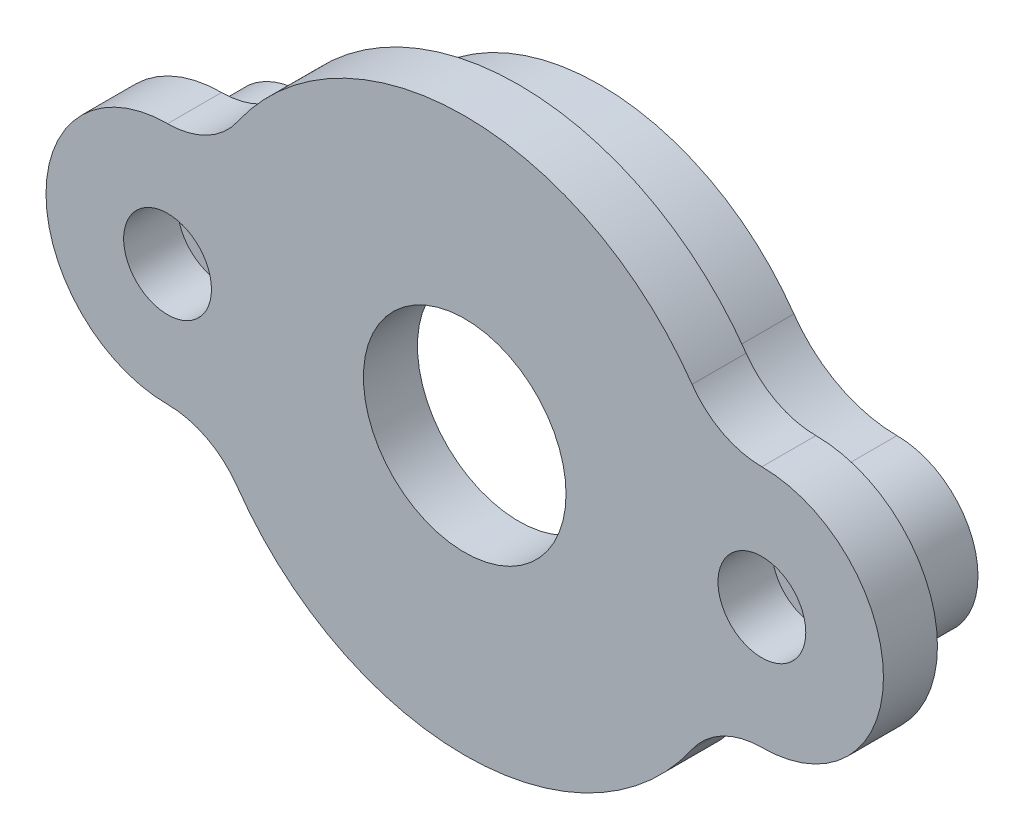
ISO-10303-21;
HEADER;
FILE_DESCRIPTION(('STEP AP214'),'2;1');
FILE_NAME('part.step','',(''),(''),'','','');
FILE_SCHEMA(('AUTOMOTIVE_DESIGN { 1 0 10303 214 1 1 1 1 }'));
ENDSEC;
DATA;
#1=APPLICATION_CONTEXT('core data for automotive mechanical design processes');
#2=APPLICATION_PROTOCOL_DEFINITION('international standard','automotive_design',2000,#1);
#3=PRODUCT_CONTEXT('',#1,'mechanical');
#4=PRODUCT('Part','Part','',(#3));
#5=PRODUCT_RELATED_PRODUCT_CATEGORY('part','',(#4));
#6=PRODUCT_DEFINITION_FORMATION('','',#4);
#7=PRODUCT_DEFINITION_CONTEXT('part definition',#1,'design');
#8=PRODUCT_DEFINITION('design','',#6,#7);
#9=PRODUCT_DEFINITION_SHAPE('','',#8);
#10=(LENGTH_UNIT() NAMED_UNIT(*) SI_UNIT(.MILLI.,.METRE.));
#11=(NAMED_UNIT(*) PLANE_ANGLE_UNIT() SI_UNIT($,.RADIAN.));
#12=(NAMED_UNIT(*) SI_UNIT($,.STERADIAN.) SOLID_ANGLE_UNIT());
#13=UNCERTAINTY_MEASURE_WITH_UNIT(LENGTH_MEASURE(1.E-05),#10,'distance_accuracy_value','');
#14=(GEOMETRIC_REPRESENTATION_CONTEXT(3) GLOBAL_UNCERTAINTY_ASSIGNED_CONTEXT((#13)) GLOBAL_UNIT_ASSIGNED_CONTEXT((#10,
#11,#12)) REPRESENTATION_CONTEXT('',''));
#15=CARTESIAN_POINT('',(0.,0.,0.));
#16=DIRECTION('',(0.,0.,1.));
#17=DIRECTION('',(1.,0.,0.));
#18=AXIS2_PLACEMENT_3D('',#15,#16,#17);
#19=CARTESIAN_POINT('',(-22.,0.,0.));
#20=DIRECTION('',(0.,0.,1.));
#21=DIRECTION('',(1.,0.,0.));
#22=AXIS2_PLACEMENT_3D('',#19,#20,#21);
#23=CYLINDRICAL_SURFACE('',#22,1.75);
#24=CARTESIAN_POINT('',(-22.,0.,0.));
#25=DIRECTION('',(0.,0.,1.));
#26=DIRECTION('',(1.,0.,0.));
#27=AXIS2_PLACEMENT_3D('',#24,#25,#26);
#28=CIRCLE('',#27,1.75);
#29=CARTESIAN_POINT('',(-20.25,0.,0.));
#30=VERTEX_POINT('',#29);
#31=EDGE_CURVE('E216',#30,#30,#28,.T.);
#32=ORIENTED_EDGE('',*,*,#31,.F.);
#33=EDGE_LOOP('',(#32));
#34=FACE_BOUND('',#33,.T.);
#35=CARTESIAN_POINT('',(-22.,0.,6.));
#36=DIRECTION('',(0.,0.,1.));
#37=DIRECTION('',(1.,0.,0.));
#38=AXIS2_PLACEMENT_3D('',#35,#36,#37);
#39=CIRCLE('',#38,1.75);
#40=CARTESIAN_POINT('',(-20.25,0.,6.));
#41=VERTEX_POINT('',#40);
#42=EDGE_CURVE('E38',#41,#41,#39,.F.);
#43=ORIENTED_EDGE('',*,*,#42,.F.);
#44=EDGE_LOOP('',(#43));
#45=FACE_BOUND('',#44,.T.);
#46=ADVANCED_FACE('F34',(#34,#45),#23,.F.);
#47=CARTESIAN_POINT('',(22.,0.,0.));
#48=DIRECTION('',(0.,0.,1.));
#49=DIRECTION('',(1.,0.,0.));
#50=AXIS2_PLACEMENT_3D('',#47,#48,#49);
#51=CYLINDRICAL_SURFACE('',#50,1.75);
#52=CARTESIAN_POINT('',(22.,0.,0.));
#53=DIRECTION('',(0.,0.,1.));
#54=DIRECTION('',(1.,0.,0.));
#55=AXIS2_PLACEMENT_3D('',#52,#53,#54);
#56=CIRCLE('',#55,1.75);
#57=CARTESIAN_POINT('',(23.75,0.,0.));
#58=VERTEX_POINT('',#57);
#59=EDGE_CURVE('E231',#58,#58,#56,.T.);
#60=ORIENTED_EDGE('',*,*,#59,.F.);
#61=EDGE_LOOP('',(#60));
#62=FACE_BOUND('',#61,.T.);
#63=CARTESIAN_POINT('',(22.,0.,6.));
#64=DIRECTION('',(0.,0.,1.));
#65=DIRECTION('',(1.,0.,0.));
#66=AXIS2_PLACEMENT_3D('',#63,#64,#65);
#67=CIRCLE('',#66,1.75);
#68=CARTESIAN_POINT('',(23.75,0.,6.));
#69=VERTEX_POINT('',#68);
#70=EDGE_CURVE('E210',#69,#69,#67,.F.);
#71=ORIENTED_EDGE('',*,*,#70,.F.);
#72=EDGE_LOOP('',(#71));
#73=FACE_BOUND('',#72,.T.);
#74=ADVANCED_FACE('F339',(#62,#73),#51,.F.);
#75=CARTESIAN_POINT('',(0.,0.,0.));
#76=DIRECTION('',(0.,0.,1.));
#77=DIRECTION('',(1.,0.,0.));
#78=AXIS2_PLACEMENT_3D('',#75,#76,#77);
#79=PLANE('',#78);
#80=ORIENTED_EDGE('',*,*,#59,.T.);
#81=EDGE_LOOP('',(#80));
#82=FACE_BOUND('',#81,.T.);
#83=ORIENTED_EDGE('',*,*,#31,.T.);
#84=EDGE_LOOP('',(#83));
#85=FACE_BOUND('',#84,.T.);
#86=CARTESIAN_POINT('',(0.,0.,0.));
#87=DIRECTION('',(0.,0.,1.));
#88=DIRECTION('',(1.,0.,0.));
#89=AXIS2_PLACEMENT_3D('',#86,#87,#88);
#90=CIRCLE('',#89,16.);
#91=CARTESIAN_POINT('',(16.,0.,0.));
#92=VERTEX_POINT('',#91);
#93=EDGE_CURVE('E179',#92,#92,#90,.T.);
#94=ORIENTED_EDGE('',*,*,#93,.T.);
#95=EDGE_LOOP('',(#94));
#96=FACE_BOUND('',#95,.T.);
#97=CARTESIAN_POINT('',(22.,-15.2934782608696,0.));
#98=DIRECTION('',(0.,0.,1.));
#99=DIRECTION('',(1.,0.,0.));
#100=AXIS2_PLACEMENT_3D('',#97,#98,#99);
#101=CIRCLE('',#100,9.29347826086955);
#102=CARTESIAN_POINT('',(22.,-6.,0.));
#103=VERTEX_POINT('',#102);
#104=CARTESIAN_POINT('',(14.369168356998,-9.98884381338742,0.));
#105=VERTEX_POINT('',#104);
#106=EDGE_CURVE('E162',#103,#105,#101,.T.);
#107=ORIENTED_EDGE('',*,*,#106,.T.);
#108=CARTESIAN_POINT('',(0.,0.,0.));
#109=DIRECTION('',(0.,0.,1.));
#110=DIRECTION('',(1.,0.,0.));
#111=AXIS2_PLACEMENT_3D('',#108,#109,#110);
#112=CIRCLE('',#111,17.5);
#113=CARTESIAN_POINT('',(-14.369168356998,-9.98884381338742,0.));
#114=VERTEX_POINT('',#113);
#115=EDGE_CURVE('E59',#114,#105,#112,.T.);
#116=ORIENTED_EDGE('',*,*,#115,.F.);
#117=CARTESIAN_POINT('',(-22.,-15.2934782608696,0.));
#118=DIRECTION('',(0.,0.,1.));
#119=DIRECTION('',(1.,0.,0.));
#120=AXIS2_PLACEMENT_3D('',#117,#118,#119);
#121=CIRCLE('',#120,9.29347826086955);
#122=CARTESIAN_POINT('',(-22.,-6.,0.));
#123=VERTEX_POINT('',#122);
#124=EDGE_CURVE('E274',#123,#114,#121,.F.);
#125=ORIENTED_EDGE('',*,*,#124,.F.);
#126=CARTESIAN_POINT('',(-22.,0.,0.));
#127=DIRECTION('',(0.,0.,1.));
#128=DIRECTION('',(1.,0.,0.));
#129=AXIS2_PLACEMENT_3D('',#126,#127,#128);
#130=CIRCLE('',#129,6.);
#131=CARTESIAN_POINT('',(-22.,6.,0.));
#132=VERTEX_POINT('',#131);
#133=EDGE_CURVE('E277',#132,#123,#130,.T.);
#134=ORIENTED_EDGE('',*,*,#133,.F.);
#135=CARTESIAN_POINT('',(-22.,15.2934782608696,0.));
#136=DIRECTION('',(0.,0.,1.));
#137=DIRECTION('',(1.,0.,0.));
#138=AXIS2_PLACEMENT_3D('',#135,#136,#137);
#139=CIRCLE('',#138,9.29347826086955);
#140=CARTESIAN_POINT('',(-14.369168356998,9.98884381338742,0.));
#141=VERTEX_POINT('',#140);
#142=EDGE_CURVE('E280',#132,#141,#139,.T.);
#143=ORIENTED_EDGE('',*,*,#142,.T.);
#144=CARTESIAN_POINT('',(0.,0.,0.));
#145=DIRECTION('',(0.,0.,1.));
#146=DIRECTION('',(1.,0.,0.));
#147=AXIS2_PLACEMENT_3D('',#144,#145,#146);
#148=CIRCLE('',#147,17.5);
#149=CARTESIAN_POINT('',(14.369168356998,9.98884381338742,0.));
#150=VERTEX_POINT('',#149);
#151=EDGE_CURVE('E283',#141,#150,#148,.F.);
#152=ORIENTED_EDGE('',*,*,#151,.T.);
#153=CARTESIAN_POINT('',(22.,15.2934782608696,0.));
#154=DIRECTION('',(0.,0.,1.));
#155=DIRECTION('',(1.,0.,0.));
#156=AXIS2_PLACEMENT_3D('',#153,#154,#155);
#157=CIRCLE('',#156,9.29347826086955);
#158=CARTESIAN_POINT('',(22.,6.,0.));
#159=VERTEX_POINT('',#158);
#160=EDGE_CURVE('E286',#159,#150,#157,.F.);
#161=ORIENTED_EDGE('',*,*,#160,.F.);
#162=CARTESIAN_POINT('',(22.,0.,0.));
#163=DIRECTION('',(0.,0.,1.));
#164=DIRECTION('',(1.,0.,0.));
#165=AXIS2_PLACEMENT_3D('',#162,#163,#164);
#166=CIRCLE('',#165,6.);
#167=EDGE_CURVE('E289',#103,#159,#166,.T.);
#168=ORIENTED_EDGE('',*,*,#167,.F.);
#169=EDGE_LOOP('',(#107,#116,#125,#134,#143,#152,#161,#168));
#170=FACE_BOUND('',#169,.T.);
#171=ADVANCED_FACE('F320',(#82,#85,#96,#170),#79,.F.);
#172=CARTESIAN_POINT('',(-22.,15.2934782608696,10.));
#173=DIRECTION('',(0.,0.,-1.));
#174=DIRECTION('',(-1.,0.,0.));
#175=AXIS2_PLACEMENT_3D('',#172,#173,#174);
#176=CYLINDRICAL_SURFACE('',#175,6.29347826086955);
#177=CARTESIAN_POINT('',(-22.,15.2934782608696,6.));
#178=DIRECTION('',(0.,0.,1.));
#179=DIRECTION('',(1.,0.,0.));
#180=AXIS2_PLACEMENT_3D('',#177,#178,#179);
#181=CIRCLE('',#180,6.29347826086955);
#182=CARTESIAN_POINT('',(-22.,9.,6.));
#183=VERTEX_POINT('',#182);
#184=CARTESIAN_POINT('',(-16.8324543610548,11.7012170385396,6.));
#185=VERTEX_POINT('',#184);
#186=EDGE_CURVE('E51',#183,#185,#181,.T.);
#187=ORIENTED_EDGE('',*,*,#186,.F.);
#188=DIRECTION('',(0.,0.,-1.));
#189=VECTOR('',#188,1.);
#190=CARTESIAN_POINT('',(-22.,9.,10.));
#191=LINE('',#190,#189);
#192=CARTESIAN_POINT('',(-22.,9.,10.));
#193=VERTEX_POINT('',#192);
#194=EDGE_CURVE('E11',#193,#183,#191,.T.);
#195=ORIENTED_EDGE('',*,*,#194,.F.);
#196=CARTESIAN_POINT('',(-22.,15.2934782608696,10.));
#197=DIRECTION('',(0.,0.,1.));
#198=DIRECTION('',(1.,0.,0.));
#199=AXIS2_PLACEMENT_3D('',#196,#197,#198);
#200=CIRCLE('',#199,6.29347826086955);
#201=CARTESIAN_POINT('',(-16.8324543610548,11.7012170385396,10.));
#202=VERTEX_POINT('',#201);
#203=EDGE_CURVE('E170',#193,#202,#200,.T.);
#204=ORIENTED_EDGE('',*,*,#203,.T.);
#205=DIRECTION('',(0.,0.,-1.));
#206=VECTOR('',#205,1.);
#207=CARTESIAN_POINT('',(-16.8324543610548,11.7012170385396,10.));
#208=LINE('',#207,#206);
#209=EDGE_CURVE('E161',#202,#185,#208,.T.);
#210=ORIENTED_EDGE('',*,*,#209,.T.);
#211=EDGE_LOOP('',(#187,#195,#204,#210));
#212=FACE_BOUND('',#211,.T.);
#213=ADVANCED_FACE('F36',(#212),#176,.F.);
#214=CARTESIAN_POINT('',(-22.,0.,10.));
#215=DIRECTION('',(0.,0.,-1.));
#216=DIRECTION('',(-1.,0.,0.));
#217=AXIS2_PLACEMENT_3D('',#214,#215,#216);
#218=CYLINDRICAL_SURFACE('',#217,9.);
#219=ORIENTED_EDGE('',*,*,#194,.T.);
#220=CARTESIAN_POINT('',(-22.,0.,6.));
#221=DIRECTION('',(0.,0.,1.));
#222=DIRECTION('',(1.,0.,0.));
#223=AXIS2_PLACEMENT_3D('',#220,#221,#222);
#224=CIRCLE('',#223,9.);
#225=CARTESIAN_POINT('',(-22.,-9.,6.));
#226=VERTEX_POINT('',#225);
#227=EDGE_CURVE('E148',#183,#226,#224,.T.);
#228=ORIENTED_EDGE('',*,*,#227,.T.);
#229=DIRECTION('',(0.,0.,-1.));
#230=VECTOR('',#229,1.);
#231=CARTESIAN_POINT('',(-22.,-9.,10.));
#232=LINE('',#231,#230);
#233=CARTESIAN_POINT('',(-22.,-9.,10.));
#234=VERTEX_POINT('',#233);
#235=EDGE_CURVE('E43',#234,#226,#232,.T.);
#236=ORIENTED_EDGE('',*,*,#235,.F.);
#237=CARTESIAN_POINT('',(-22.,0.,10.));
#238=DIRECTION('',(0.,0.,1.));
#239=DIRECTION('',(1.,0.,0.));
#240=AXIS2_PLACEMENT_3D('',#237,#238,#239);
#241=CIRCLE('',#240,9.);
#242=EDGE_CURVE('E165',#193,#234,#241,.T.);
#243=ORIENTED_EDGE('',*,*,#242,.F.);
#244=EDGE_LOOP('',(#219,#228,#236,#243));
#245=FACE_BOUND('',#244,.T.);
#246=ADVANCED_FACE('F164',(#245),#218,.T.);
#247=CARTESIAN_POINT('',(-22.,-15.2934782608696,10.));
#248=DIRECTION('',(0.,0.,-1.));
#249=DIRECTION('',(-1.,0.,0.));
#250=AXIS2_PLACEMENT_3D('',#247,#248,#249);
#251=CYLINDRICAL_SURFACE('',#250,6.29347826086955);
#252=ORIENTED_EDGE('',*,*,#235,.T.);
#253=CARTESIAN_POINT('',(-22.,-15.2934782608696,6.));
#254=DIRECTION('',(0.,0.,1.));
#255=DIRECTION('',(1.,0.,0.));
#256=AXIS2_PLACEMENT_3D('',#253,#254,#255);
#257=CIRCLE('',#256,6.29347826086955);
#258=CARTESIAN_POINT('',(-16.8324543610548,-11.7012170385395,6.));
#259=VERTEX_POINT('',#258);
#260=EDGE_CURVE('E152',#226,#259,#257,.F.);
#261=ORIENTED_EDGE('',*,*,#260,.T.);
#262=DIRECTION('',(0.,0.,-1.));
#263=VECTOR('',#262,1.);
#264=CARTESIAN_POINT('',(-16.8324543610548,-11.7012170385395,10.));
#265=LINE('',#264,#263);
#266=CARTESIAN_POINT('',(-16.8324543610548,-11.7012170385395,10.));
#267=VERTEX_POINT('',#266);
#268=EDGE_CURVE('E207',#267,#259,#265,.T.);
#269=ORIENTED_EDGE('',*,*,#268,.F.);
#270=CARTESIAN_POINT('',(-22.,-15.2934782608696,10.));
#271=DIRECTION('',(0.,0.,1.));
#272=DIRECTION('',(1.,0.,0.));
#273=AXIS2_PLACEMENT_3D('',#270,#271,#272);
#274=CIRCLE('',#273,6.29347826086955);
#275=EDGE_CURVE('E169',#234,#267,#274,.F.);
#276=ORIENTED_EDGE('',*,*,#275,.F.);
#277=EDGE_LOOP('',(#252,#261,#269,#276));
#278=FACE_BOUND('',#277,.T.);
#279=ADVANCED_FACE('F561',(#278),#251,.F.);
#280=CARTESIAN_POINT('',(0.,0.,10.));
#281=DIRECTION('',(0.,0.,-1.));
#282=DIRECTION('',(-1.,0.,0.));
#283=AXIS2_PLACEMENT_3D('',#280,#281,#282);
#284=CYLINDRICAL_SURFACE('',#283,20.5);
#285=ORIENTED_EDGE('',*,*,#268,.T.);
#286=CARTESIAN_POINT('',(0.,0.,6.));
#287=DIRECTION('',(0.,0.,1.));
#288=DIRECTION('',(1.,0.,0.));
#289=AXIS2_PLACEMENT_3D('',#286,#287,#288);
#290=CIRCLE('',#289,20.5);
#291=CARTESIAN_POINT('',(16.8324543610548,-11.7012170385396,6.));
#292=VERTEX_POINT('',#291);
#293=EDGE_CURVE('E237',#259,#292,#290,.T.);
#294=ORIENTED_EDGE('',*,*,#293,.T.);
#295=DIRECTION('',(0.,0.,-1.));
#296=VECTOR('',#295,1.);
#297=CARTESIAN_POINT('',(16.8324543610548,-11.7012170385396,10.));
#298=LINE('',#297,#296);
#299=CARTESIAN_POINT('',(16.8324543610548,-11.7012170385396,10.));
#300=VERTEX_POINT('',#299);
#301=EDGE_CURVE('E204',#300,#292,#298,.T.);
#302=ORIENTED_EDGE('',*,*,#301,.F.);
#303=CARTESIAN_POINT('',(0.,0.,10.));
#304=DIRECTION('',(0.,0.,1.));
#305=DIRECTION('',(1.,0.,0.));
#306=AXIS2_PLACEMENT_3D('',#303,#304,#305);
#307=CIRCLE('',#306,20.5);
#308=EDGE_CURVE('E184',#267,#300,#307,.T.);
#309=ORIENTED_EDGE('',*,*,#308,.F.);
#310=EDGE_LOOP('',(#285,#294,#302,#309));
#311=FACE_BOUND('',#310,.T.);
#312=ADVANCED_FACE('F552',(#311),#284,.T.);
#313=CARTESIAN_POINT('',(22.,-15.2934782608696,10.));
#314=DIRECTION('',(0.,0.,-1.));
#315=DIRECTION('',(-1.,0.,0.));
#316=AXIS2_PLACEMENT_3D('',#313,#314,#315);
#317=CYLINDRICAL_SURFACE('',#316,6.29347826086955);
#318=CARTESIAN_POINT('',(22.,-15.2934782608696,6.));
#319=DIRECTION('',(0.,0.,1.));
#320=DIRECTION('',(1.,0.,0.));
#321=AXIS2_PLACEMENT_3D('',#318,#319,#320);
#322=CIRCLE('',#321,6.29347826086955);
#323=CARTESIAN_POINT('',(22.,-9.00000000000001,6.));
#324=VERTEX_POINT('',#323);
#325=EDGE_CURVE('E240',#324,#292,#322,.T.);
#326=ORIENTED_EDGE('',*,*,#325,.F.);
#327=DIRECTION('',(0.,0.,-1.));
#328=VECTOR('',#327,1.);
#329=CARTESIAN_POINT('',(22.,-9.00000000000001,10.));
#330=LINE('',#329,#328);
#331=CARTESIAN_POINT('',(22.,-9.00000000000001,10.));
#332=VERTEX_POINT('',#331);
#333=EDGE_CURVE('E201',#332,#324,#330,.T.);
#334=ORIENTED_EDGE('',*,*,#333,.F.);
#335=CARTESIAN_POINT('',(22.,-15.2934782608696,10.));
#336=DIRECTION('',(0.,0.,1.));
#337=DIRECTION('',(1.,0.,0.));
#338=AXIS2_PLACEMENT_3D('',#335,#336,#337);
#339=CIRCLE('',#338,6.29347826086955);
#340=EDGE_CURVE('E186',#332,#300,#339,.T.);
#341=ORIENTED_EDGE('',*,*,#340,.T.);
#342=ORIENTED_EDGE('',*,*,#301,.T.);
#343=EDGE_LOOP('',(#326,#334,#341,#342));
#344=FACE_BOUND('',#343,.T.);
#345=ADVANCED_FACE('F543',(#344),#317,.F.);
#346=CARTESIAN_POINT('',(22.,0.,10.));
#347=DIRECTION('',(0.,0.,-1.));
#348=DIRECTION('',(-1.,0.,0.));
#349=AXIS2_PLACEMENT_3D('',#346,#347,#348);
#350=CYLINDRICAL_SURFACE('',#349,9.00000000000001);
#351=ORIENTED_EDGE('',*,*,#333,.T.);
#352=CARTESIAN_POINT('',(22.,0.,6.));
#353=DIRECTION('',(0.,0.,1.));
#354=DIRECTION('',(1.,0.,0.));
#355=AXIS2_PLACEMENT_3D('',#352,#353,#354);
#356=CIRCLE('',#355,9.00000000000001);
#357=CARTESIAN_POINT('',(22.,9.00000000000001,6.));
#358=VERTEX_POINT('',#357);
#359=EDGE_CURVE('E242',#324,#358,#356,.T.);
#360=ORIENTED_EDGE('',*,*,#359,.T.);
#361=DIRECTION('',(0.,0.,-1.));
#362=VECTOR('',#361,1.);
#363=CARTESIAN_POINT('',(22.,9.00000000000001,10.));
#364=LINE('',#363,#362);
#365=CARTESIAN_POINT('',(22.,9.00000000000001,10.));
#366=VERTEX_POINT('',#365);
#367=EDGE_CURVE('E198',#366,#358,#364,.T.);
#368=ORIENTED_EDGE('',*,*,#367,.F.);
#369=CARTESIAN_POINT('',(22.,0.,10.));
#370=DIRECTION('',(0.,0.,1.));
#371=DIRECTION('',(1.,0.,0.));
#372=AXIS2_PLACEMENT_3D('',#369,#370,#371);
#373=CIRCLE('',#372,9.00000000000001);
#374=EDGE_CURVE('E189',#332,#366,#373,.T.);
#375=ORIENTED_EDGE('',*,*,#374,.F.);
#376=EDGE_LOOP('',(#351,#360,#368,#375));
#377=FACE_BOUND('',#376,.T.);
#378=ADVANCED_FACE('F534',(#377),#350,.T.);
#379=CARTESIAN_POINT('',(22.,15.2934782608696,10.));
#380=DIRECTION('',(0.,0.,-1.));
#381=DIRECTION('',(-1.,0.,0.));
#382=AXIS2_PLACEMENT_3D('',#379,#380,#381);
#383=CYLINDRICAL_SURFACE('',#382,6.29347826086955);
#384=ORIENTED_EDGE('',*,*,#367,.T.);
#385=CARTESIAN_POINT('',(22.,15.2934782608696,6.));
#386=DIRECTION('',(0.,0.,1.));
#387=DIRECTION('',(1.,0.,0.));
#388=AXIS2_PLACEMENT_3D('',#385,#386,#387);
#389=CIRCLE('',#388,6.29347826086955);
#390=CARTESIAN_POINT('',(16.8324543610548,11.7012170385396,6.));
#391=VERTEX_POINT('',#390);
#392=EDGE_CURVE('E245',#358,#391,#389,.F.);
#393=ORIENTED_EDGE('',*,*,#392,.T.);
#394=DIRECTION('',(0.,0.,-1.));
#395=VECTOR('',#394,1.);
#396=CARTESIAN_POINT('',(16.8324543610548,11.7012170385396,10.));
#397=LINE('',#396,#395);
#398=CARTESIAN_POINT('',(16.8324543610548,11.7012170385396,10.));
#399=VERTEX_POINT('',#398);
#400=EDGE_CURVE('E195',#399,#391,#397,.T.);
#401=ORIENTED_EDGE('',*,*,#400,.F.);
#402=CARTESIAN_POINT('',(22.,15.2934782608696,10.));
#403=DIRECTION('',(0.,0.,1.));
#404=DIRECTION('',(1.,0.,0.));
#405=AXIS2_PLACEMENT_3D('',#402,#403,#404);
#406=CIRCLE('',#405,6.29347826086955);
#407=EDGE_CURVE('E191',#366,#399,#406,.F.);
#408=ORIENTED_EDGE('',*,*,#407,.F.);
#409=EDGE_LOOP('',(#384,#393,#401,#408));
#410=FACE_BOUND('',#409,.T.);
#411=ADVANCED_FACE('F525',(#410),#383,.F.);
#412=CARTESIAN_POINT('',(0.,0.,10.));
#413=DIRECTION('',(0.,0.,-1.));
#414=DIRECTION('',(-1.,0.,0.));
#415=AXIS2_PLACEMENT_3D('',#412,#413,#414);
#416=CYLINDRICAL_SURFACE('',#415,20.5);
#417=CARTESIAN_POINT('',(0.,0.,6.));
#418=DIRECTION('',(0.,0.,1.));
#419=DIRECTION('',(1.,0.,0.));
#420=AXIS2_PLACEMENT_3D('',#417,#418,#419);
#421=CIRCLE('',#420,20.5);
#422=EDGE_CURVE('E248',#185,#391,#421,.F.);
#423=ORIENTED_EDGE('',*,*,#422,.F.);
#424=ORIENTED_EDGE('',*,*,#209,.F.);
#425=CARTESIAN_POINT('',(0.,0.,10.));
#426=DIRECTION('',(0.,0.,1.));
#427=DIRECTION('',(1.,0.,0.));
#428=AXIS2_PLACEMENT_3D('',#425,#426,#427);
#429=CIRCLE('',#428,20.5);
#430=EDGE_CURVE('E175',#202,#399,#429,.F.);
#431=ORIENTED_EDGE('',*,*,#430,.T.);
#432=ORIENTED_EDGE('',*,*,#400,.T.);
#433=EDGE_LOOP('',(#423,#424,#431,#432));
#434=FACE_BOUND('',#433,.T.);
#435=ADVANCED_FACE('F335',(#434),#416,.T.);
#436=CARTESIAN_POINT('',(0.,0.,10.));
#437=DIRECTION('',(0.,0.,1.));
#438=DIRECTION('',(1.,0.,0.));
#439=AXIS2_PLACEMENT_3D('',#436,#437,#438);
#440=PLANE('',#439);
#441=CARTESIAN_POINT('',(22.,0.,10.));
#442=DIRECTION('',(0.,0.,1.));
#443=DIRECTION('',(1.,0.,0.));
#444=AXIS2_PLACEMENT_3D('',#441,#442,#443);
#445=CIRCLE('',#444,3.25);
#446=CARTESIAN_POINT('',(25.25,0.,10.));
#447=VERTEX_POINT('',#446);
#448=EDGE_CURVE('E218',#447,#447,#445,.T.);
#449=ORIENTED_EDGE('',*,*,#448,.F.);
#450=EDGE_LOOP('',(#449));
#451=FACE_BOUND('',#450,.T.);
#452=CARTESIAN_POINT('',(-22.,0.,10.));
#453=DIRECTION('',(0.,0.,1.));
#454=DIRECTION('',(1.,0.,0.));
#455=AXIS2_PLACEMENT_3D('',#452,#453,#454);
#456=CIRCLE('',#455,3.25);
#457=CARTESIAN_POINT('',(-18.75,0.,10.));
#458=VERTEX_POINT('',#457);
#459=EDGE_CURVE('E228',#458,#458,#456,.T.);
#460=ORIENTED_EDGE('',*,*,#459,.F.);
#461=EDGE_LOOP('',(#460));
#462=FACE_BOUND('',#461,.T.);
#463=CARTESIAN_POINT('',(0.,0.,10.));
#464=DIRECTION('',(0.,0.,1.));
#465=DIRECTION('',(1.,0.,0.));
#466=AXIS2_PLACEMENT_3D('',#463,#464,#465);
#467=CIRCLE('',#466,7.5);
#468=CARTESIAN_POINT('',(7.5,0.,10.));
#469=VERTEX_POINT('',#468);
#470=EDGE_CURVE('E310',#469,#469,#467,.T.);
#471=ORIENTED_EDGE('',*,*,#470,.F.);
#472=EDGE_LOOP('',(#471));
#473=FACE_BOUND('',#472,.T.);
#474=ORIENTED_EDGE('',*,*,#203,.F.);
#475=ORIENTED_EDGE('',*,*,#242,.T.);
#476=ORIENTED_EDGE('',*,*,#275,.T.);
#477=ORIENTED_EDGE('',*,*,#308,.T.);
#478=ORIENTED_EDGE('',*,*,#340,.F.);
#479=ORIENTED_EDGE('',*,*,#374,.T.);
#480=ORIENTED_EDGE('',*,*,#407,.T.);
#481=ORIENTED_EDGE('',*,*,#430,.F.);
#482=EDGE_LOOP('',(#474,#475,#476,#477,#478,#479,#480,#481));
#483=FACE_BOUND('',#482,.T.);
#484=ADVANCED_FACE('F173',(#451,#462,#473,#483),#440,.T.);
#485=CARTESIAN_POINT('',(0.,0.,6.));
#486=DIRECTION('',(0.,0.,-1.));
#487=DIRECTION('',(-1.,0.,0.));
#488=AXIS2_PLACEMENT_3D('',#485,#486,#487);
#489=CYLINDRICAL_SURFACE('',#488,16.);
#490=CARTESIAN_POINT('',(0.,0.,6.));
#491=DIRECTION('',(0.,0.,1.));
#492=DIRECTION('',(1.,0.,0.));
#493=AXIS2_PLACEMENT_3D('',#490,#491,#492);
#494=CIRCLE('',#493,16.);
#495=CARTESIAN_POINT('',(16.,0.,6.));
#496=VERTEX_POINT('',#495);
#497=EDGE_CURVE('E176',#496,#496,#494,.T.);
#498=ORIENTED_EDGE('',*,*,#497,.T.);
#499=EDGE_LOOP('',(#498));
#500=FACE_BOUND('',#499,.T.);
#501=ORIENTED_EDGE('',*,*,#93,.F.);
#502=EDGE_LOOP('',(#501));
#503=FACE_BOUND('',#502,.T.);
#504=ADVANCED_FACE('F323',(#500,#503),#489,.F.);
#505=CARTESIAN_POINT('',(0.,0.,6.));
#506=DIRECTION('',(0.,0.,1.));
#507=DIRECTION('',(1.,0.,0.));
#508=AXIS2_PLACEMENT_3D('',#505,#506,#507);
#509=PLANE('',#508);
#510=CARTESIAN_POINT('',(0.,0.,6.));
#511=DIRECTION('',(0.,0.,1.));
#512=DIRECTION('',(1.,0.,0.));
#513=AXIS2_PLACEMENT_3D('',#510,#511,#512);
#514=CIRCLE('',#513,7.5);
#515=CARTESIAN_POINT('',(7.5,0.,6.));
#516=VERTEX_POINT('',#515);
#517=EDGE_CURVE('E313',#516,#516,#514,.F.);
#518=ORIENTED_EDGE('',*,*,#517,.F.);
#519=EDGE_LOOP('',(#518));
#520=FACE_BOUND('',#519,.T.);
#521=ORIENTED_EDGE('',*,*,#497,.F.);
#522=EDGE_LOOP('',(#521));
#523=FACE_BOUND('',#522,.T.);
#524=ADVANCED_FACE('F325',(#520,#523),#509,.F.);
#525=CARTESIAN_POINT('',(0.,0.,10.));
#526=DIRECTION('',(0.,0.,-1.));
#527=DIRECTION('',(-1.,0.,0.));
#528=AXIS2_PLACEMENT_3D('',#525,#526,#527);
#529=CYLINDRICAL_SURFACE('',#528,7.5);
#530=ORIENTED_EDGE('',*,*,#470,.T.);
#531=EDGE_LOOP('',(#530));
#532=FACE_BOUND('',#531,.T.);
#533=ORIENTED_EDGE('',*,*,#517,.T.);
#534=EDGE_LOOP('',(#533));
#535=FACE_BOUND('',#534,.T.);
#536=ADVANCED_FACE('F332',(#532,#535),#529,.F.);
#537=CARTESIAN_POINT('',(0.,0.,6.));
#538=DIRECTION('',(0.,0.,-1.));
#539=DIRECTION('',(-1.,0.,0.));
#540=AXIS2_PLACEMENT_3D('',#537,#538,#539);
#541=CYLINDRICAL_SURFACE('',#540,17.5);
#542=ORIENTED_EDGE('',*,*,#115,.T.);
#543=DIRECTION('',(0.,0.,-1.));
#544=VECTOR('',#543,1.);
#545=CARTESIAN_POINT('',(14.369168356998,-9.98884381338742,6.));
#546=LINE('',#545,#544);
#547=CARTESIAN_POINT('',(14.369168356998,-9.98884381338742,6.));
#548=VERTEX_POINT('',#547);
#549=EDGE_CURVE('E272',#548,#105,#546,.T.);
#550=ORIENTED_EDGE('',*,*,#549,.F.);
#551=CARTESIAN_POINT('',(0.,0.,6.));
#552=DIRECTION('',(0.,0.,1.));
#553=DIRECTION('',(1.,0.,0.));
#554=AXIS2_PLACEMENT_3D('',#551,#552,#553);
#555=CIRCLE('',#554,17.5);
#556=CARTESIAN_POINT('',(-14.369168356998,-9.98884381338742,6.));
#557=VERTEX_POINT('',#556);
#558=EDGE_CURVE('E250',#557,#548,#555,.T.);
#559=ORIENTED_EDGE('',*,*,#558,.F.);
#560=DIRECTION('',(0.,0.,-1.));
#561=VECTOR('',#560,1.);
#562=CARTESIAN_POINT('',(-14.369168356998,-9.98884381338742,6.));
#563=LINE('',#562,#561);
#564=EDGE_CURVE('E308',#557,#114,#563,.T.);
#565=ORIENTED_EDGE('',*,*,#564,.T.);
#566=EDGE_LOOP('',(#542,#550,#559,#565));
#567=FACE_BOUND('',#566,.T.);
#568=ADVANCED_FACE('F381',(#567),#541,.T.);
#569=CARTESIAN_POINT('',(-22.,-15.2934782608696,6.));
#570=DIRECTION('',(0.,0.,-1.));
#571=DIRECTION('',(-1.,0.,0.));
#572=AXIS2_PLACEMENT_3D('',#569,#570,#571);
#573=CYLINDRICAL_SURFACE('',#572,9.29347826086955);
#574=ORIENTED_EDGE('',*,*,#124,.T.);
#575=ORIENTED_EDGE('',*,*,#564,.F.);
#576=CARTESIAN_POINT('',(-22.,-15.2934782608696,6.));
#577=DIRECTION('',(0.,0.,1.));
#578=DIRECTION('',(1.,0.,0.));
#579=AXIS2_PLACEMENT_3D('',#576,#577,#578);
#580=CIRCLE('',#579,9.29347826086955);
#581=CARTESIAN_POINT('',(-22.,-6.,6.));
#582=VERTEX_POINT('',#581);
#583=EDGE_CURVE('E253',#582,#557,#580,.F.);
#584=ORIENTED_EDGE('',*,*,#583,.F.);
#585=DIRECTION('',(0.,0.,-1.));
#586=VECTOR('',#585,1.);
#587=CARTESIAN_POINT('',(-22.,-6.,6.));
#588=LINE('',#587,#586);
#589=EDGE_CURVE('E306',#582,#123,#588,.T.);
#590=ORIENTED_EDGE('',*,*,#589,.T.);
#591=EDGE_LOOP('',(#574,#575,#584,#590));
#592=FACE_BOUND('',#591,.T.);
#593=ADVANCED_FACE('F377',(#592),#573,.F.);
#594=CARTESIAN_POINT('',(-22.,0.,6.));
#595=DIRECTION('',(0.,0.,-1.));
#596=DIRECTION('',(-1.,0.,0.));
#597=AXIS2_PLACEMENT_3D('',#594,#595,#596);
#598=CYLINDRICAL_SURFACE('',#597,6.);
#599=ORIENTED_EDGE('',*,*,#133,.T.);
#600=ORIENTED_EDGE('',*,*,#589,.F.);
#601=CARTESIAN_POINT('',(-22.,0.,6.));
#602=DIRECTION('',(0.,0.,1.));
#603=DIRECTION('',(1.,0.,0.));
#604=AXIS2_PLACEMENT_3D('',#601,#602,#603);
#605=CIRCLE('',#604,6.);
#606=CARTESIAN_POINT('',(-22.,6.,6.));
#607=VERTEX_POINT('',#606);
#608=EDGE_CURVE('E256',#607,#582,#605,.T.);
#609=ORIENTED_EDGE('',*,*,#608,.F.);
#610=DIRECTION('',(0.,0.,-1.));
#611=VECTOR('',#610,1.);
#612=CARTESIAN_POINT('',(-22.,6.,6.));
#613=LINE('',#612,#611);
#614=EDGE_CURVE('E304',#607,#132,#613,.T.);
#615=ORIENTED_EDGE('',*,*,#614,.T.);
#616=EDGE_LOOP('',(#599,#600,#609,#615));
#617=FACE_BOUND('',#616,.T.);
#618=ADVANCED_FACE('F373',(#617),#598,.T.);
#619=CARTESIAN_POINT('',(-22.,15.2934782608696,6.));
#620=DIRECTION('',(0.,0.,-1.));
#621=DIRECTION('',(-1.,0.,0.));
#622=AXIS2_PLACEMENT_3D('',#619,#620,#621);
#623=CYLINDRICAL_SURFACE('',#622,9.29347826086955);
#624=ORIENTED_EDGE('',*,*,#142,.F.);
#625=ORIENTED_EDGE('',*,*,#614,.F.);
#626=CARTESIAN_POINT('',(-22.,15.2934782608696,6.));
#627=DIRECTION('',(0.,0.,1.));
#628=DIRECTION('',(1.,0.,0.));
#629=AXIS2_PLACEMENT_3D('',#626,#627,#628);
#630=CIRCLE('',#629,9.29347826086955);
#631=CARTESIAN_POINT('',(-14.369168356998,9.98884381338742,6.));
#632=VERTEX_POINT('',#631);
#633=EDGE_CURVE('E259',#607,#632,#630,.T.);
#634=ORIENTED_EDGE('',*,*,#633,.T.);
#635=DIRECTION('',(0.,0.,-1.));
#636=VECTOR('',#635,1.);
#637=CARTESIAN_POINT('',(-14.369168356998,9.98884381338742,6.));
#638=LINE('',#637,#636);
#639=EDGE_CURVE('E301',#632,#141,#638,.T.);
#640=ORIENTED_EDGE('',*,*,#639,.T.);
#641=EDGE_LOOP('',(#624,#625,#634,#640));
#642=FACE_BOUND('',#641,.T.);
#643=ADVANCED_FACE('F369',(#642),#623,.F.);
#644=CARTESIAN_POINT('',(0.,0.,6.));
#645=DIRECTION('',(0.,0.,-1.));
#646=DIRECTION('',(-1.,0.,0.));
#647=AXIS2_PLACEMENT_3D('',#644,#645,#646);
#648=CYLINDRICAL_SURFACE('',#647,17.5);
#649=ORIENTED_EDGE('',*,*,#151,.F.);
#650=ORIENTED_EDGE('',*,*,#639,.F.);
#651=CARTESIAN_POINT('',(0.,0.,6.));
#652=DIRECTION('',(0.,0.,1.));
#653=DIRECTION('',(1.,0.,0.));
#654=AXIS2_PLACEMENT_3D('',#651,#652,#653);
#655=CIRCLE('',#654,17.5);
#656=CARTESIAN_POINT('',(14.369168356998,9.98884381338742,6.));
#657=VERTEX_POINT('',#656);
#658=EDGE_CURVE('E262',#632,#657,#655,.F.);
#659=ORIENTED_EDGE('',*,*,#658,.T.);
#660=DIRECTION('',(0.,0.,-1.));
#661=VECTOR('',#660,1.);
#662=CARTESIAN_POINT('',(14.369168356998,9.98884381338742,6.));
#663=LINE('',#662,#661);
#664=EDGE_CURVE('E299',#657,#150,#663,.T.);
#665=ORIENTED_EDGE('',*,*,#664,.T.);
#666=EDGE_LOOP('',(#649,#650,#659,#665));
#667=FACE_BOUND('',#666,.T.);
#668=ADVANCED_FACE('F365',(#667),#648,.T.);
#669=CARTESIAN_POINT('',(22.,15.2934782608696,6.));
#670=DIRECTION('',(0.,0.,-1.));
#671=DIRECTION('',(-1.,0.,0.));
#672=AXIS2_PLACEMENT_3D('',#669,#670,#671);
#673=CYLINDRICAL_SURFACE('',#672,9.29347826086955);
#674=ORIENTED_EDGE('',*,*,#160,.T.);
#675=ORIENTED_EDGE('',*,*,#664,.F.);
#676=CARTESIAN_POINT('',(22.,15.2934782608696,6.));
#677=DIRECTION('',(0.,0.,1.));
#678=DIRECTION('',(1.,0.,0.));
#679=AXIS2_PLACEMENT_3D('',#676,#677,#678);
#680=CIRCLE('',#679,9.29347826086955);
#681=CARTESIAN_POINT('',(22.,6.,6.));
#682=VERTEX_POINT('',#681);
#683=EDGE_CURVE('E264',#682,#657,#680,.F.);
#684=ORIENTED_EDGE('',*,*,#683,.F.);
#685=DIRECTION('',(0.,0.,-1.));
#686=VECTOR('',#685,1.);
#687=CARTESIAN_POINT('',(22.,6.,6.));
#688=LINE('',#687,#686);
#689=EDGE_CURVE('E297',#682,#159,#688,.T.);
#690=ORIENTED_EDGE('',*,*,#689,.T.);
#691=EDGE_LOOP('',(#674,#675,#684,#690));
#692=FACE_BOUND('',#691,.T.);
#693=ADVANCED_FACE('F361',(#692),#673,.F.);
#694=CARTESIAN_POINT('',(22.,0.,6.));
#695=DIRECTION('',(0.,0.,-1.));
#696=DIRECTION('',(-1.,0.,0.));
#697=AXIS2_PLACEMENT_3D('',#694,#695,#696);
#698=CYLINDRICAL_SURFACE('',#697,6.);
#699=ORIENTED_EDGE('',*,*,#167,.T.);
#700=ORIENTED_EDGE('',*,*,#689,.F.);
#701=CARTESIAN_POINT('',(22.,0.,6.));
#702=DIRECTION('',(0.,0.,1.));
#703=DIRECTION('',(1.,0.,0.));
#704=AXIS2_PLACEMENT_3D('',#701,#702,#703);
#705=CIRCLE('',#704,6.);
#706=CARTESIAN_POINT('',(22.,-6.,6.));
#707=VERTEX_POINT('',#706);
#708=EDGE_CURVE('E267',#707,#682,#705,.T.);
#709=ORIENTED_EDGE('',*,*,#708,.F.);
#710=DIRECTION('',(0.,0.,-1.));
#711=VECTOR('',#710,1.);
#712=CARTESIAN_POINT('',(22.,-6.,6.));
#713=LINE('',#712,#711);
#714=EDGE_CURVE('E295',#707,#103,#713,.T.);
#715=ORIENTED_EDGE('',*,*,#714,.T.);
#716=EDGE_LOOP('',(#699,#700,#709,#715));
#717=FACE_BOUND('',#716,.T.);
#718=ADVANCED_FACE('F357',(#717),#698,.T.);
#719=CARTESIAN_POINT('',(22.,-15.2934782608696,6.));
#720=DIRECTION('',(0.,0.,-1.));
#721=DIRECTION('',(-1.,0.,0.));
#722=AXIS2_PLACEMENT_3D('',#719,#720,#721);
#723=CYLINDRICAL_SURFACE('',#722,9.29347826086955);
#724=ORIENTED_EDGE('',*,*,#106,.F.);
#725=ORIENTED_EDGE('',*,*,#714,.F.);
#726=CARTESIAN_POINT('',(22.,-15.2934782608696,6.));
#727=DIRECTION('',(0.,0.,1.));
#728=DIRECTION('',(1.,0.,0.));
#729=AXIS2_PLACEMENT_3D('',#726,#727,#728);
#730=CIRCLE('',#729,9.29347826086955);
#731=EDGE_CURVE('E270',#707,#548,#730,.T.);
#732=ORIENTED_EDGE('',*,*,#731,.T.);
#733=ORIENTED_EDGE('',*,*,#549,.T.);
#734=EDGE_LOOP('',(#724,#725,#732,#733));
#735=FACE_BOUND('',#734,.T.);
#736=ADVANCED_FACE('F354',(#735),#723,.F.);
#737=CARTESIAN_POINT('',(0.,0.,6.));
#738=DIRECTION('',(0.,0.,1.));
#739=DIRECTION('',(1.,0.,0.));
#740=AXIS2_PLACEMENT_3D('',#737,#738,#739);
#741=PLANE('',#740);
#742=ORIENTED_EDGE('',*,*,#186,.T.);
#743=ORIENTED_EDGE('',*,*,#422,.T.);
#744=ORIENTED_EDGE('',*,*,#392,.F.);
#745=ORIENTED_EDGE('',*,*,#359,.F.);
#746=ORIENTED_EDGE('',*,*,#325,.T.);
#747=ORIENTED_EDGE('',*,*,#293,.F.);
#748=ORIENTED_EDGE('',*,*,#260,.F.);
#749=ORIENTED_EDGE('',*,*,#227,.F.);
#750=EDGE_LOOP('',(#742,#743,#744,#745,#746,#747,#748,#749));
#751=FACE_BOUND('',#750,.T.);
#752=ORIENTED_EDGE('',*,*,#558,.T.);
#753=ORIENTED_EDGE('',*,*,#731,.F.);
#754=ORIENTED_EDGE('',*,*,#708,.T.);
#755=ORIENTED_EDGE('',*,*,#683,.T.);
#756=ORIENTED_EDGE('',*,*,#658,.F.);
#757=ORIENTED_EDGE('',*,*,#633,.F.);
#758=ORIENTED_EDGE('',*,*,#608,.T.);
#759=ORIENTED_EDGE('',*,*,#583,.T.);
#760=EDGE_LOOP('',(#752,#753,#754,#755,#756,#757,#758,#759));
#761=FACE_BOUND('',#760,.T.);
#762=ADVANCED_FACE('F149',(#751,#761),#741,.F.);
#763=CARTESIAN_POINT('',(22.,0.,6.));
#764=DIRECTION('',(0.,0.,1.));
#765=DIRECTION('',(1.,0.,0.));
#766=AXIS2_PLACEMENT_3D('',#763,#764,#765);
#767=PLANE('',#766);
#768=CARTESIAN_POINT('',(22.,0.,6.));
#769=DIRECTION('',(0.,0.,1.));
#770=DIRECTION('',(1.,0.,0.));
#771=AXIS2_PLACEMENT_3D('',#768,#769,#770);
#772=CIRCLE('',#771,3.25);
#773=CARTESIAN_POINT('',(25.25,0.,6.));
#774=VERTEX_POINT('',#773);
#775=EDGE_CURVE('E212',#774,#774,#772,.T.);
#776=ORIENTED_EDGE('',*,*,#775,.T.);
#777=EDGE_LOOP('',(#776));
#778=FACE_BOUND('',#777,.T.);
#779=ORIENTED_EDGE('',*,*,#70,.T.);
#780=EDGE_LOOP('',(#779));
#781=FACE_BOUND('',#780,.T.);
#782=ADVANCED_FACE('F353',(#778,#781),#767,.T.);
#783=CARTESIAN_POINT('',(22.,0.,6.));
#784=DIRECTION('',(0.,0.,1.));
#785=DIRECTION('',(1.,0.,0.));
#786=AXIS2_PLACEMENT_3D('',#783,#784,#785);
#787=CYLINDRICAL_SURFACE('',#786,3.25);
#788=ORIENTED_EDGE('',*,*,#775,.F.);
#789=EDGE_LOOP('',(#788));
#790=FACE_BOUND('',#789,.T.);
#791=ORIENTED_EDGE('',*,*,#448,.T.);
#792=EDGE_LOOP('',(#791));
#793=FACE_BOUND('',#792,.T.);
#794=ADVANCED_FACE('F438',(#790,#793),#787,.F.);
#795=CARTESIAN_POINT('',(-22.,0.,6.));
#796=DIRECTION('',(0.,0.,1.));
#797=DIRECTION('',(1.,0.,0.));
#798=AXIS2_PLACEMENT_3D('',#795,#796,#797);
#799=PLANE('',#798);
#800=CARTESIAN_POINT('',(-22.,0.,6.));
#801=DIRECTION('',(0.,0.,1.));
#802=DIRECTION('',(1.,0.,0.));
#803=AXIS2_PLACEMENT_3D('',#800,#801,#802);
#804=CIRCLE('',#803,3.25);
#805=CARTESIAN_POINT('',(-18.75,0.,6.));
#806=VERTEX_POINT('',#805);
#807=EDGE_CURVE('E223',#806,#806,#804,.T.);
#808=ORIENTED_EDGE('',*,*,#807,.T.);
#809=EDGE_LOOP('',(#808));
#810=FACE_BOUND('',#809,.T.);
#811=ORIENTED_EDGE('',*,*,#42,.T.);
#812=EDGE_LOOP('',(#811));
#813=FACE_BOUND('',#812,.T.);
#814=ADVANCED_FACE('F446',(#810,#813),#799,.T.);
#815=CARTESIAN_POINT('',(-22.,0.,6.));
#816=DIRECTION('',(0.,0.,1.));
#817=DIRECTION('',(1.,0.,0.));
#818=AXIS2_PLACEMENT_3D('',#815,#816,#817);
#819=CYLINDRICAL_SURFACE('',#818,3.25);
#820=ORIENTED_EDGE('',*,*,#807,.F.);
#821=EDGE_LOOP('',(#820));
#822=FACE_BOUND('',#821,.T.);
#823=ORIENTED_EDGE('',*,*,#459,.T.);
#824=EDGE_LOOP('',(#823));
#825=FACE_BOUND('',#824,.T.);
#826=ADVANCED_FACE('F454',(#822,#825),#819,.F.);
#827=CLOSED_SHELL('',(#46,#74,#171,#213,#246,#279,#312,#345,#378,#411,#435,#484,#504,#524,#536,
#568,#593,#618,#643,#668,#693,#718,#736,#762,#782,#794,#814,#826));
#828=MANIFOLD_SOLID_BREP('B2',#827);
#829=ADVANCED_BREP_SHAPE_REPRESENTATION('',(#18,#828),#14);
#830=SHAPE_DEFINITION_REPRESENTATION(#9,#829);
ENDSEC;
END-ISO-10303-21;
